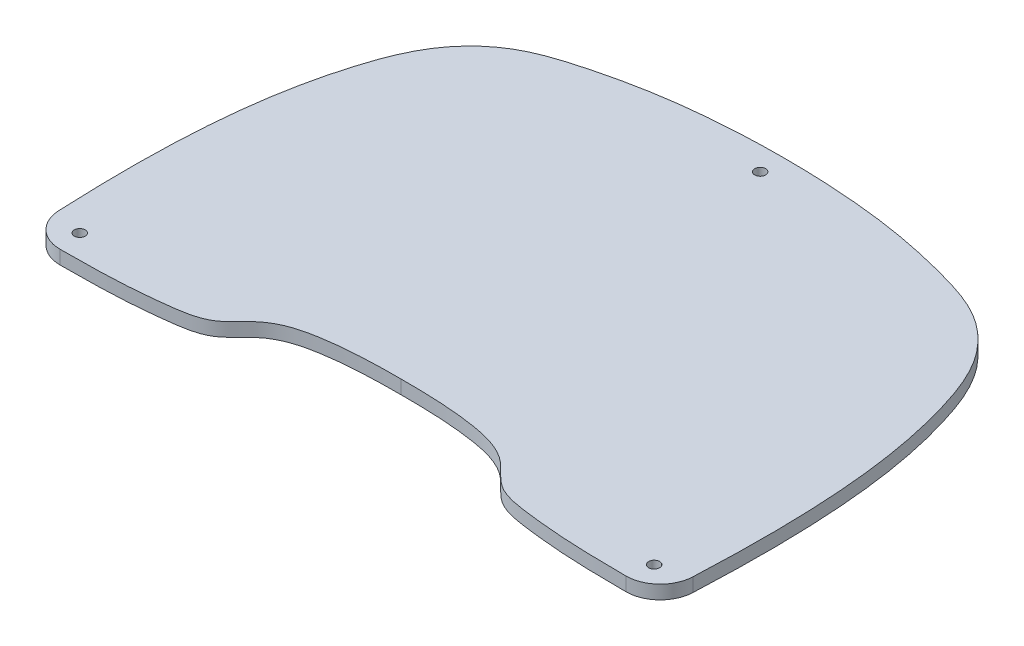
ISO-10303-21;
HEADER;
FILE_DESCRIPTION(('STEP AP214'),'2;1');
FILE_NAME('part.step','',(''),(''),'','','');
FILE_SCHEMA(('AUTOMOTIVE_DESIGN { 1 0 10303 214 1 1 1 1 }'));
ENDSEC;
DATA;
#1=APPLICATION_CONTEXT('core data for automotive mechanical design processes');
#2=APPLICATION_PROTOCOL_DEFINITION('international standard','automotive_design',2000,#1);
#3=PRODUCT_CONTEXT('',#1,'mechanical');
#4=PRODUCT('Part','Part','',(#3));
#5=PRODUCT_RELATED_PRODUCT_CATEGORY('part','',(#4));
#6=PRODUCT_DEFINITION_FORMATION('','',#4);
#7=PRODUCT_DEFINITION_CONTEXT('part definition',#1,'design');
#8=PRODUCT_DEFINITION('design','',#6,#7);
#9=PRODUCT_DEFINITION_SHAPE('','',#8);
#10=(LENGTH_UNIT() NAMED_UNIT(*) SI_UNIT(.MILLI.,.METRE.));
#11=(NAMED_UNIT(*) PLANE_ANGLE_UNIT() SI_UNIT($,.RADIAN.));
#12=(NAMED_UNIT(*) SI_UNIT($,.STERADIAN.) SOLID_ANGLE_UNIT());
#13=UNCERTAINTY_MEASURE_WITH_UNIT(LENGTH_MEASURE(1.E-05),#10,'distance_accuracy_value','');
#14=(GEOMETRIC_REPRESENTATION_CONTEXT(3) GLOBAL_UNCERTAINTY_ASSIGNED_CONTEXT((#13)) GLOBAL_UNIT_ASSIGNED_CONTEXT((#10,
#11,#12)) REPRESENTATION_CONTEXT('',''));
#15=CARTESIAN_POINT('',(0.,0.,0.));
#16=DIRECTION('',(0.,0.,1.));
#17=DIRECTION('',(1.,0.,0.));
#18=AXIS2_PLACEMENT_3D('',#15,#16,#17);
#19=CARTESIAN_POINT('',(0.,0.,0.));
#20=DIRECTION('',(0.,-1.,0.));
#21=DIRECTION('',(0.,0.,-1.));
#22=AXIS2_PLACEMENT_3D('',#19,#20,#21);
#23=PLANE('',#22);
#24=CARTESIAN_POINT('',(-84.,0.,-17.));
#25=DIRECTION('',(0.,1.,0.));
#26=DIRECTION('',(0.,0.,1.));
#27=AXIS2_PLACEMENT_3D('',#24,#25,#26);
#28=CIRCLE('',#27,1.6);
#29=CARTESIAN_POINT('',(-84.,0.,-15.4));
#30=VERTEX_POINT('',#29);
#31=EDGE_CURVE('E551',#30,#30,#28,.T.);
#32=ORIENTED_EDGE('',*,*,#31,.T.);
#33=EDGE_LOOP('',(#32));
#34=FACE_BOUND('',#33,.T.);
#35=CARTESIAN_POINT('',(84.,0.,-17.));
#36=DIRECTION('',(0.,1.,0.));
#37=DIRECTION('',(0.,0.,1.));
#38=AXIS2_PLACEMENT_3D('',#35,#36,#37);
#39=CIRCLE('',#38,1.6);
#40=CARTESIAN_POINT('',(84.,0.,-15.4));
#41=VERTEX_POINT('',#40);
#42=EDGE_CURVE('E562',#41,#41,#39,.T.);
#43=ORIENTED_EDGE('',*,*,#42,.T.);
#44=EDGE_LOOP('',(#43));
#45=FACE_BOUND('',#44,.T.);
#46=CARTESIAN_POINT('',(0.,0.,-132.));
#47=DIRECTION('',(0.,-1.,0.));
#48=DIRECTION('',(0.,0.,-1.));
#49=AXIS2_PLACEMENT_3D('',#46,#47,#48);
#50=CIRCLE('',#49,1.59999999999999);
#51=CARTESIAN_POINT('',(0.,0.,-133.6));
#52=VERTEX_POINT('',#51);
#53=EDGE_CURVE('E415',#52,#52,#50,.T.);
#54=ORIENTED_EDGE('',*,*,#53,.F.);
#55=EDGE_LOOP('',(#54));
#56=FACE_BOUND('',#55,.T.);
#57=CARTESIAN_POINT('',(92.2335145068298,0.,-9.99999999999992));
#58=CARTESIAN_POINT('',(93.1090313055752,0.,-24.461653992885));
#59=CARTESIAN_POINT('',(94.1412976787401,0.,-55.9294278930205));
#60=CARTESIAN_POINT('',(89.8487997363687,0.,-89.0425351081658));
#61=CARTESIAN_POINT('',(82.7766183598568,0.,-109.219212765688));
#62=CARTESIAN_POINT('',(77.5057588749509,0.,-118.879248593149));
#63=CARTESIAN_POINT('',(67.5606743100797,0.,-127.964233668267));
#64=CARTESIAN_POINT('',(51.2025143300991,0.,-133.204450958364));
#65=CARTESIAN_POINT('',(28.9563277305296,0.,-138.000468292935));
#66=CARTESIAN_POINT('',(10.5008714660227,0.,-139.));
#67=CARTESIAN_POINT('',(0.,0.,-139.));
#68=B_SPLINE_CURVE_WITH_KNOTS('',3,(#57,#58,#59,#60,#61,#62,#63,#64,#65,#66,#67),.UNSPECIFIED.,
.F.,.F.,(4,1,1,1,1,1,1,1,4),(0.048683264924351,0.273512027245697,0.499348707548917,
0.541604418075915,0.589205487808775,0.661188987966892,0.734095028903621,0.840040992214581,1.),.UNSPECIFIED.);
#69=CARTESIAN_POINT('',(0.,0.,-139.));
#70=VERTEX_POINT('',#69);
#71=CARTESIAN_POINT('',(92.7421838232833,0.,-19.5419697216967));
#72=VERTEX_POINT('',#71);
#73=EDGE_CURVE('E439',#70,#72,#68,.F.);
#74=ORIENTED_EDGE('',*,*,#73,.T.);
#75=CARTESIAN_POINT('',(82.7525074101446,0.,-19.9962440449628));
#76=DIRECTION('',(0.,-1.,0.));
#77=DIRECTION('',(0.,0.,-1.));
#78=AXIS2_PLACEMENT_3D('',#75,#76,#77);
#79=CIRCLE('',#78,10.);
#80=CARTESIAN_POINT('',(82.730131227239,0.,-9.9962690796722));
#81=VERTEX_POINT('',#80);
#82=EDGE_CURVE('E466',#72,#81,#79,.T.);
#83=ORIENTED_EDGE('',*,*,#82,.T.);
#84=CARTESIAN_POINT('',(92.2335145068298,0.,-9.99999999999993));
#85=CARTESIAN_POINT('',(80.6643013871117,0.,-9.99999999999993));
#86=CARTESIAN_POINT('',(67.3797546573043,0.,-9.83297634828211));
#87=CARTESIAN_POINT('',(50.8212813424914,0.,-11.7564459144532));
#88=CARTESIAN_POINT('',(41.6876400077974,0.,-13.09279348235));
#89=CARTESIAN_POINT('',(34.6105420896924,0.,-23.0328201001358));
#90=CARTESIAN_POINT('',(19.1579227536028,0.,-26.7732538807536));
#91=CARTESIAN_POINT('',(6.71734960168822,0.,-26.9999999999999));
#92=CARTESIAN_POINT('',(0.,0.,-26.9999999999999));
#93=B_SPLINE_CURVE_WITH_KNOTS('',3,(#84,#85,#86,#87,#88,#89,#90,#91,#92),.UNSPECIFIED.,.F.,.F.,
(4,1,1,1,1,1,4),(0.,0.354854857166383,0.417368962198801,0.52508950542856,0.626100692192997,
0.774450144496227,1.),.UNSPECIFIED.);
#94=CARTESIAN_POINT('',(0.,0.,-26.9999999999999));
#95=VERTEX_POINT('',#94);
#96=EDGE_CURVE('E419',#95,#81,#93,.F.);
#97=ORIENTED_EDGE('',*,*,#96,.F.);
#98=CARTESIAN_POINT('',(-92.2335145068298,0.,-9.99999999999993));
#99=CARTESIAN_POINT('',(-80.6643013871117,0.,-9.99999999999993));
#100=CARTESIAN_POINT('',(-67.3797546573043,0.,-9.83297634828211));
#101=CARTESIAN_POINT('',(-50.8212813424914,0.,-11.7564459144532));
#102=CARTESIAN_POINT('',(-41.6876400077974,0.,-13.09279348235));
#103=CARTESIAN_POINT('',(-34.6105420896924,0.,-23.0328201001358));
#104=CARTESIAN_POINT('',(-19.1579227536028,0.,-26.7732538807536));
#105=CARTESIAN_POINT('',(-6.71734960168822,0.,-26.9999999999999));
#106=CARTESIAN_POINT('',(0.,0.,-26.9999999999999));
#107=B_SPLINE_CURVE_WITH_KNOTS('',3,(#98,#99,#100,#101,#102,#103,#104,#105,#106),.UNSPECIFIED.,
.F.,.F.,(4,1,1,1,1,1,4),(0.,0.354854857166383,0.417368962198801,0.52508950542856,
0.626100692192997,0.774450144496227,1.),.UNSPECIFIED.);
#108=CARTESIAN_POINT('',(-82.730131227239,0.,-9.9962690796722));
#109=VERTEX_POINT('',#108);
#110=EDGE_CURVE('E407',#95,#109,#107,.F.);
#111=ORIENTED_EDGE('',*,*,#110,.T.);
#112=CARTESIAN_POINT('',(-82.7525074101446,0.,-19.9962440449628));
#113=DIRECTION('',(0.,-1.,0.));
#114=DIRECTION('',(0.,0.,-1.));
#115=AXIS2_PLACEMENT_3D('',#112,#113,#114);
#116=CIRCLE('',#115,10.);
#117=CARTESIAN_POINT('',(-92.7421838232834,0.,-19.5419697216967));
#118=VERTEX_POINT('',#117);
#119=EDGE_CURVE('E353',#109,#118,#116,.T.);
#120=ORIENTED_EDGE('',*,*,#119,.T.);
#121=CARTESIAN_POINT('',(-92.2335145068298,0.,-9.99999999999992));
#122=CARTESIAN_POINT('',(-93.1090313055752,0.,-24.461653992885));
#123=CARTESIAN_POINT('',(-94.1412976787401,0.,-55.9294278930205));
#124=CARTESIAN_POINT('',(-89.8487997363687,0.,-89.0425351081658));
#125=CARTESIAN_POINT('',(-82.7766183598568,0.,-109.219212765688));
#126=CARTESIAN_POINT('',(-77.5057588749509,0.,-118.879248593149));
#127=CARTESIAN_POINT('',(-67.5606743100797,0.,-127.964233668267));
#128=CARTESIAN_POINT('',(-51.2025143300991,0.,-133.204450958364));
#129=CARTESIAN_POINT('',(-28.9563277305296,0.,-138.000468292935));
#130=CARTESIAN_POINT('',(-10.5008714660227,0.,-139.));
#131=CARTESIAN_POINT('',(0.,0.,-139.));
#132=B_SPLINE_CURVE_WITH_KNOTS('',3,(#121,#122,#123,#124,#125,#126,#127,#128,#129,#130,#131),
.UNSPECIFIED.,.F.,.F.,(4,1,1,1,1,1,1,1,4),(0.048683264924351,0.273512027245697,
0.499348707548917,0.541604418075915,0.589205487808775,0.661188987966892,0.734095028903621,
0.840040992214581,1.),.UNSPECIFIED.);
#133=EDGE_CURVE('E431',#70,#118,#132,.F.);
#134=ORIENTED_EDGE('',*,*,#133,.F.);
#135=EDGE_LOOP('',(#74,#83,#97,#111,#120,#134));
#136=FACE_BOUND('',#135,.T.);
#137=ADVANCED_FACE('F332',(#34,#45,#56,#136),#23,.T.);
#138=CARTESIAN_POINT('',(92.2335145068298,-1.,-9.99999999999992));
#139=CARTESIAN_POINT('',(93.1090313055752,-1.,-24.461653992885));
#140=CARTESIAN_POINT('',(94.1412976787401,-1.,-55.9294278930205));
#141=CARTESIAN_POINT('',(89.8487997363687,-1.,-89.0425351081658));
#142=CARTESIAN_POINT('',(82.7766183598568,-1.,-109.219212765688));
#143=CARTESIAN_POINT('',(77.5057588749509,-1.,-118.879248593149));
#144=CARTESIAN_POINT('',(67.5606743100797,-1.,-127.964233668267));
#145=CARTESIAN_POINT('',(51.2025143300991,-1.,-133.204450958364));
#146=CARTESIAN_POINT('',(28.9563277305296,-1.,-138.000468292935));
#147=CARTESIAN_POINT('',(10.5008714660227,-1.,-139.));
#148=CARTESIAN_POINT('',(0.,-1.,-139.));
#149=B_SPLINE_CURVE_WITH_KNOTS('',3,(#138,#139,#140,#141,#142,#143,#144,#145,#146,#147,#148),
.UNSPECIFIED.,.F.,.F.,(4,1,1,1,1,1,1,1,4),(0.048683264924351,0.273512027245697,
0.499348707548917,0.541604418075915,0.589205487808775,0.661188987966892,0.734095028903621,
0.840040992214581,1.),.UNSPECIFIED.);
#150=DIRECTION('',(0.,1.,0.));
#151=VECTOR('',#150,1.);
#152=SURFACE_OF_LINEAR_EXTRUSION('',#149,#151);
#153=CARTESIAN_POINT('',(92.2335145068298,4.,-9.99999999999992));
#154=CARTESIAN_POINT('',(93.1090313055752,4.,-24.461653992885));
#155=CARTESIAN_POINT('',(94.1412976787401,4.,-55.9294278930205));
#156=CARTESIAN_POINT('',(89.8487997363687,4.,-89.0425351081658));
#157=CARTESIAN_POINT('',(82.7766183598568,4.,-109.219212765688));
#158=CARTESIAN_POINT('',(77.5057588749509,4.,-118.879248593149));
#159=CARTESIAN_POINT('',(67.5606743100797,4.,-127.964233668267));
#160=CARTESIAN_POINT('',(51.2025143300991,4.,-133.204450958364));
#161=CARTESIAN_POINT('',(28.9563277305296,4.,-138.000468292935));
#162=CARTESIAN_POINT('',(10.5008714660227,4.,-139.));
#163=CARTESIAN_POINT('',(0.,4.,-139.));
#164=B_SPLINE_CURVE_WITH_KNOTS('',3,(#153,#154,#155,#156,#157,#158,#159,#160,#161,#162,#163),
.UNSPECIFIED.,.F.,.F.,(4,1,1,1,1,1,1,1,4),(0.048683264924351,0.273512027245697,
0.499348707548917,0.541604418075915,0.589205487808775,0.661188987966892,0.734095028903621,
0.840040992214581,1.),.UNSPECIFIED.);
#165=CARTESIAN_POINT('',(92.7421838232833,4.,-19.5419697216967));
#166=VERTEX_POINT('',#165);
#167=CARTESIAN_POINT('',(0.,4.,-139.));
#168=VERTEX_POINT('',#167);
#169=EDGE_CURVE('E404',#166,#168,#164,.T.);
#170=ORIENTED_EDGE('',*,*,#169,.F.);
#171=DIRECTION('',(0.,1.,0.));
#172=VECTOR('',#171,1.);
#173=CARTESIAN_POINT('',(92.7421838232834,4.,-19.5419697216967));
#174=LINE('',#173,#172);
#175=EDGE_CURVE('E461',#166,#72,#174,.F.);
#176=ORIENTED_EDGE('',*,*,#175,.T.);
#177=ORIENTED_EDGE('',*,*,#73,.F.);
#178=DIRECTION('',(0.,1.,0.));
#179=VECTOR('',#178,1.);
#180=CARTESIAN_POINT('',(0.,-1.,-139.));
#181=LINE('',#180,#179);
#182=EDGE_CURVE('E410',#70,#168,#181,.T.);
#183=ORIENTED_EDGE('',*,*,#182,.T.);
#184=EDGE_LOOP('',(#170,#176,#177,#183));
#185=FACE_BOUND('',#184,.T.);
#186=ADVANCED_FACE('F482',(#185),#152,.T.);
#187=CARTESIAN_POINT('',(-92.2335145068298,-1.,-9.99999999999992));
#188=CARTESIAN_POINT('',(-93.1090313055752,-1.,-24.461653992885));
#189=CARTESIAN_POINT('',(-94.1412976787401,-1.,-55.9294278930205));
#190=CARTESIAN_POINT('',(-89.8487997363687,-1.,-89.0425351081658));
#191=CARTESIAN_POINT('',(-82.7766183598568,-1.,-109.219212765688));
#192=CARTESIAN_POINT('',(-77.5057588749509,-1.,-118.879248593149));
#193=CARTESIAN_POINT('',(-67.5606743100797,-1.,-127.964233668267));
#194=CARTESIAN_POINT('',(-51.2025143300991,-1.,-133.204450958364));
#195=CARTESIAN_POINT('',(-28.9563277305296,-1.,-138.000468292935));
#196=CARTESIAN_POINT('',(-10.5008714660227,-1.,-139.));
#197=CARTESIAN_POINT('',(0.,-1.,-139.));
#198=B_SPLINE_CURVE_WITH_KNOTS('',3,(#187,#188,#189,#190,#191,#192,#193,#194,#195,#196,#197),
.UNSPECIFIED.,.F.,.F.,(4,1,1,1,1,1,1,1,4),(0.048683264924351,0.273512027245697,
0.499348707548917,0.541604418075915,0.589205487808775,0.661188987966892,0.734095028903621,
0.840040992214581,1.),.UNSPECIFIED.);
#199=DIRECTION('',(0.,1.,0.));
#200=VECTOR('',#199,1.);
#201=SURFACE_OF_LINEAR_EXTRUSION('',#198,#200);
#202=ORIENTED_EDGE('',*,*,#133,.T.);
#203=DIRECTION('',(0.,1.,0.));
#204=VECTOR('',#203,1.);
#205=CARTESIAN_POINT('',(-92.7421838232834,0.,-19.5419697216967));
#206=LINE('',#205,#204);
#207=CARTESIAN_POINT('',(-92.7421838232834,4.,-19.5419697216967));
#208=VERTEX_POINT('',#207);
#209=EDGE_CURVE('E341',#118,#208,#206,.T.);
#210=ORIENTED_EDGE('',*,*,#209,.T.);
#211=CARTESIAN_POINT('',(-92.2335145068298,4.,-9.99999999999992));
#212=CARTESIAN_POINT('',(-93.1090313055752,4.,-24.461653992885));
#213=CARTESIAN_POINT('',(-94.1412976787401,4.,-55.9294278930205));
#214=CARTESIAN_POINT('',(-89.8487997363687,4.,-89.0425351081658));
#215=CARTESIAN_POINT('',(-82.7766183598568,4.,-109.219212765688));
#216=CARTESIAN_POINT('',(-77.5057588749509,4.,-118.879248593149));
#217=CARTESIAN_POINT('',(-67.5606743100797,4.,-127.964233668267));
#218=CARTESIAN_POINT('',(-51.2025143300991,4.,-133.204450958364));
#219=CARTESIAN_POINT('',(-28.9563277305296,4.,-138.000468292935));
#220=CARTESIAN_POINT('',(-10.5008714660227,4.,-139.));
#221=CARTESIAN_POINT('',(0.,4.,-139.));
#222=B_SPLINE_CURVE_WITH_KNOTS('',3,(#211,#212,#213,#214,#215,#216,#217,#218,#219,#220,#221),
.UNSPECIFIED.,.F.,.F.,(4,1,1,1,1,1,1,1,4),(0.048683264924351,0.273512027245697,
0.499348707548917,0.541604418075915,0.589205487808775,0.661188987966892,0.734095028903621,
0.840040992214581,1.),.UNSPECIFIED.);
#223=EDGE_CURVE('E394',#208,#168,#222,.T.);
#224=ORIENTED_EDGE('',*,*,#223,.T.);
#225=ORIENTED_EDGE('',*,*,#182,.F.);
#226=EDGE_LOOP('',(#202,#210,#224,#225));
#227=FACE_BOUND('',#226,.T.);
#228=ADVANCED_FACE('F472',(#227),#201,.F.);
#229=CARTESIAN_POINT('',(-92.2335145068298,-1.,-9.99999999999993));
#230=CARTESIAN_POINT('',(-80.6643013871117,-1.,-9.99999999999993));
#231=CARTESIAN_POINT('',(-67.3797546573043,-1.,-9.83297634828211));
#232=CARTESIAN_POINT('',(-50.8212813424914,-1.,-11.7564459144532));
#233=CARTESIAN_POINT('',(-41.6876400077974,-1.,-13.09279348235));
#234=CARTESIAN_POINT('',(-34.6105420896924,-1.,-23.0328201001358));
#235=CARTESIAN_POINT('',(-19.1579227536028,-1.,-26.7732538807536));
#236=CARTESIAN_POINT('',(-6.71734960168822,-1.,-26.9999999999999));
#237=CARTESIAN_POINT('',(0.,-1.,-26.9999999999999));
#238=B_SPLINE_CURVE_WITH_KNOTS('',3,(#229,#230,#231,#232,#233,#234,#235,#236,#237),
.UNSPECIFIED.,.F.,.F.,(4,1,1,1,1,1,4),(0.,0.354854857166383,0.417368962198801,0.52508950542856,
0.626100692192997,0.774450144496227,1.),.UNSPECIFIED.);
#239=DIRECTION('',(0.,1.,0.));
#240=VECTOR('',#239,1.);
#241=SURFACE_OF_LINEAR_EXTRUSION('',#238,#240);
#242=CARTESIAN_POINT('',(-92.2335145068298,4.,-9.99999999999993));
#243=CARTESIAN_POINT('',(-80.6643013871117,4.,-9.99999999999993));
#244=CARTESIAN_POINT('',(-67.3797546573043,4.,-9.83297634828211));
#245=CARTESIAN_POINT('',(-50.8212813424914,4.,-11.7564459144532));
#246=CARTESIAN_POINT('',(-41.6876400077974,4.,-13.09279348235));
#247=CARTESIAN_POINT('',(-34.6105420896924,4.,-23.0328201001358));
#248=CARTESIAN_POINT('',(-19.1579227536028,4.,-26.7732538807536));
#249=CARTESIAN_POINT('',(-6.71734960168822,4.,-26.9999999999999));
#250=CARTESIAN_POINT('',(0.,4.,-26.9999999999999));
#251=B_SPLINE_CURVE_WITH_KNOTS('',3,(#242,#243,#244,#245,#246,#247,#248,#249,#250),
.UNSPECIFIED.,.F.,.F.,(4,1,1,1,1,1,4),(0.,0.354854857166383,0.417368962198801,0.52508950542856,
0.626100692192997,0.774450144496227,1.),.UNSPECIFIED.);
#252=CARTESIAN_POINT('',(-82.730131227239,4.,-9.9962690796722));
#253=VERTEX_POINT('',#252);
#254=CARTESIAN_POINT('',(0.,4.,-26.9999999999999));
#255=VERTEX_POINT('',#254);
#256=EDGE_CURVE('E386',#253,#255,#251,.T.);
#257=ORIENTED_EDGE('',*,*,#256,.F.);
#258=DIRECTION('',(0.,1.,0.));
#259=VECTOR('',#258,1.);
#260=CARTESIAN_POINT('',(-82.730131227234,4.,-9.99626907967222));
#261=LINE('',#260,#259);
#262=EDGE_CURVE('E12',#253,#109,#261,.F.);
#263=ORIENTED_EDGE('',*,*,#262,.T.);
#264=ORIENTED_EDGE('',*,*,#110,.F.);
#265=DIRECTION('',(0.,1.,0.));
#266=VECTOR('',#265,1.);
#267=CARTESIAN_POINT('',(0.,-1.,-26.9999999999999));
#268=LINE('',#267,#266);
#269=EDGE_CURVE('E400',#95,#255,#268,.T.);
#270=ORIENTED_EDGE('',*,*,#269,.T.);
#271=EDGE_LOOP('',(#257,#263,#264,#270));
#272=FACE_BOUND('',#271,.T.);
#273=ADVANCED_FACE('F406',(#272),#241,.T.);
#274=CARTESIAN_POINT('',(92.2335145068298,-1.,-9.99999999999993));
#275=CARTESIAN_POINT('',(80.6643013871117,-1.,-9.99999999999993));
#276=CARTESIAN_POINT('',(67.3797546573043,-1.,-9.83297634828211));
#277=CARTESIAN_POINT('',(50.8212813424914,-1.,-11.7564459144532));
#278=CARTESIAN_POINT('',(41.6876400077974,-1.,-13.09279348235));
#279=CARTESIAN_POINT('',(34.6105420896924,-1.,-23.0328201001358));
#280=CARTESIAN_POINT('',(19.1579227536028,-1.,-26.7732538807536));
#281=CARTESIAN_POINT('',(6.71734960168822,-1.,-26.9999999999999));
#282=CARTESIAN_POINT('',(0.,-1.,-26.9999999999999));
#283=B_SPLINE_CURVE_WITH_KNOTS('',3,(#274,#275,#276,#277,#278,#279,#280,#281,#282),
.UNSPECIFIED.,.F.,.F.,(4,1,1,1,1,1,4),(0.,0.354854857166383,0.417368962198801,0.52508950542856,
0.626100692192997,0.774450144496227,1.),.UNSPECIFIED.);
#284=DIRECTION('',(0.,1.,0.));
#285=VECTOR('',#284,1.);
#286=SURFACE_OF_LINEAR_EXTRUSION('',#283,#285);
#287=ORIENTED_EDGE('',*,*,#96,.T.);
#288=DIRECTION('',(0.,1.,0.));
#289=VECTOR('',#288,1.);
#290=CARTESIAN_POINT('',(82.730131227234,0.,-9.99626907967222));
#291=LINE('',#290,#289);
#292=CARTESIAN_POINT('',(82.730131227239,4.,-9.9962690796722));
#293=VERTEX_POINT('',#292);
#294=EDGE_CURVE('E402',#81,#293,#291,.T.);
#295=ORIENTED_EDGE('',*,*,#294,.T.);
#296=CARTESIAN_POINT('',(92.2335145068298,4.,-9.99999999999993));
#297=CARTESIAN_POINT('',(80.6643013871117,4.,-9.99999999999993));
#298=CARTESIAN_POINT('',(67.3797546573043,4.,-9.83297634828211));
#299=CARTESIAN_POINT('',(50.8212813424914,4.,-11.7564459144532));
#300=CARTESIAN_POINT('',(41.6876400077974,4.,-13.09279348235));
#301=CARTESIAN_POINT('',(34.6105420896924,4.,-23.0328201001358));
#302=CARTESIAN_POINT('',(19.1579227536028,4.,-26.7732538807536));
#303=CARTESIAN_POINT('',(6.71734960168822,4.,-26.9999999999999));
#304=CARTESIAN_POINT('',(0.,4.,-26.9999999999999));
#305=B_SPLINE_CURVE_WITH_KNOTS('',3,(#296,#297,#298,#299,#300,#301,#302,#303,#304),
.UNSPECIFIED.,.F.,.F.,(4,1,1,1,1,1,4),(0.,0.354854857166383,0.417368962198801,0.52508950542856,
0.626100692192997,0.774450144496227,1.),.UNSPECIFIED.);
#306=EDGE_CURVE('E389',#293,#255,#305,.T.);
#307=ORIENTED_EDGE('',*,*,#306,.T.);
#308=ORIENTED_EDGE('',*,*,#269,.F.);
#309=EDGE_LOOP('',(#287,#295,#307,#308));
#310=FACE_BOUND('',#309,.T.);
#311=ADVANCED_FACE('F399',(#310),#286,.F.);
#312=CARTESIAN_POINT('',(0.,-1.,-132.));
#313=DIRECTION('',(0.,1.,0.));
#314=DIRECTION('',(0.,0.,1.));
#315=AXIS2_PLACEMENT_3D('',#312,#313,#314);
#316=CYLINDRICAL_SURFACE('',#315,1.59999999999999);
#317=ORIENTED_EDGE('',*,*,#53,.T.);
#318=EDGE_LOOP('',(#317));
#319=FACE_BOUND('',#318,.T.);
#320=CARTESIAN_POINT('',(0.,4.,-132.));
#321=DIRECTION('',(0.,1.,0.));
#322=DIRECTION('',(0.,0.,1.));
#323=AXIS2_PLACEMENT_3D('',#320,#321,#322);
#324=CIRCLE('',#323,1.59999999999999);
#325=CARTESIAN_POINT('',(0.,4.,-130.4));
#326=VERTEX_POINT('',#325);
#327=EDGE_CURVE('E480',#326,#326,#324,.T.);
#328=ORIENTED_EDGE('',*,*,#327,.T.);
#329=EDGE_LOOP('',(#328));
#330=FACE_BOUND('',#329,.T.);
#331=ADVANCED_FACE('F493',(#319,#330),#316,.F.);
#332=CARTESIAN_POINT('',(0.,4.,0.));
#333=DIRECTION('',(0.,-1.,0.));
#334=DIRECTION('',(0.,0.,-1.));
#335=AXIS2_PLACEMENT_3D('',#332,#333,#334);
#336=PLANE('',#335);
#337=CARTESIAN_POINT('',(-84.,4.,-17.));
#338=DIRECTION('',(0.,1.,0.));
#339=DIRECTION('',(0.,0.,1.));
#340=AXIS2_PLACEMENT_3D('',#337,#338,#339);
#341=CIRCLE('',#340,1.6);
#342=CARTESIAN_POINT('',(-84.,4.,-15.4));
#343=VERTEX_POINT('',#342);
#344=EDGE_CURVE('E554',#343,#343,#341,.T.);
#345=ORIENTED_EDGE('',*,*,#344,.F.);
#346=EDGE_LOOP('',(#345));
#347=FACE_BOUND('',#346,.T.);
#348=CARTESIAN_POINT('',(84.,4.,-17.));
#349=DIRECTION('',(0.,1.,0.));
#350=DIRECTION('',(0.,0.,1.));
#351=AXIS2_PLACEMENT_3D('',#348,#349,#350);
#352=CIRCLE('',#351,1.6);
#353=CARTESIAN_POINT('',(84.,4.,-15.4));
#354=VERTEX_POINT('',#353);
#355=EDGE_CURVE('E556',#354,#354,#352,.T.);
#356=ORIENTED_EDGE('',*,*,#355,.F.);
#357=EDGE_LOOP('',(#356));
#358=FACE_BOUND('',#357,.T.);
#359=ORIENTED_EDGE('',*,*,#327,.F.);
#360=EDGE_LOOP('',(#359));
#361=FACE_BOUND('',#360,.T.);
#362=ORIENTED_EDGE('',*,*,#306,.F.);
#363=CARTESIAN_POINT('',(82.7525074101446,4.,-19.9962440449628));
#364=DIRECTION('',(0.,-1.,0.));
#365=DIRECTION('',(0.,0.,-1.));
#366=AXIS2_PLACEMENT_3D('',#363,#364,#365);
#367=CIRCLE('',#366,10.);
#368=EDGE_CURVE('E458',#293,#166,#367,.F.);
#369=ORIENTED_EDGE('',*,*,#368,.T.);
#370=ORIENTED_EDGE('',*,*,#169,.T.);
#371=ORIENTED_EDGE('',*,*,#223,.F.);
#372=CARTESIAN_POINT('',(-82.7525074101446,4.,-19.9962440449628));
#373=DIRECTION('',(0.,-1.,0.));
#374=DIRECTION('',(0.,0.,-1.));
#375=AXIS2_PLACEMENT_3D('',#372,#373,#374);
#376=CIRCLE('',#375,10.);
#377=EDGE_CURVE('E391',#208,#253,#376,.F.);
#378=ORIENTED_EDGE('',*,*,#377,.T.);
#379=ORIENTED_EDGE('',*,*,#256,.T.);
#380=EDGE_LOOP('',(#362,#369,#370,#371,#378,#379));
#381=FACE_BOUND('',#380,.T.);
#382=ADVANCED_FACE('F388',(#347,#358,#361,#381),#336,.F.);
#383=CARTESIAN_POINT('',(82.7525074101446,2.,-19.9962440449628));
#384=DIRECTION('',(0.,1.,0.));
#385=DIRECTION('',(0.,0.,1.));
#386=AXIS2_PLACEMENT_3D('',#383,#384,#385);
#387=CYLINDRICAL_SURFACE('',#386,10.);
#388=ORIENTED_EDGE('',*,*,#82,.F.);
#389=ORIENTED_EDGE('',*,*,#175,.F.);
#390=ORIENTED_EDGE('',*,*,#368,.F.);
#391=ORIENTED_EDGE('',*,*,#294,.F.);
#392=EDGE_LOOP('',(#388,#389,#390,#391));
#393=FACE_BOUND('',#392,.T.);
#394=ADVANCED_FACE('F485',(#393),#387,.T.);
#395=CARTESIAN_POINT('',(-82.7525074101446,2.,-19.9962440449628));
#396=DIRECTION('',(0.,1.,0.));
#397=DIRECTION('',(0.,0.,1.));
#398=AXIS2_PLACEMENT_3D('',#395,#396,#397);
#399=CYLINDRICAL_SURFACE('',#398,10.);
#400=ORIENTED_EDGE('',*,*,#119,.F.);
#401=ORIENTED_EDGE('',*,*,#262,.F.);
#402=ORIENTED_EDGE('',*,*,#377,.F.);
#403=ORIENTED_EDGE('',*,*,#209,.F.);
#404=EDGE_LOOP('',(#400,#401,#402,#403));
#405=FACE_BOUND('',#404,.T.);
#406=ADVANCED_FACE('F334',(#405),#399,.T.);
#407=CARTESIAN_POINT('',(84.,0.,-17.));
#408=DIRECTION('',(0.,1.,0.));
#409=DIRECTION('',(0.,0.,1.));
#410=AXIS2_PLACEMENT_3D('',#407,#408,#409);
#411=CYLINDRICAL_SURFACE('',#410,1.6);
#412=ORIENTED_EDGE('',*,*,#42,.F.);
#413=EDGE_LOOP('',(#412));
#414=FACE_BOUND('',#413,.T.);
#415=ORIENTED_EDGE('',*,*,#355,.T.);
#416=EDGE_LOOP('',(#415));
#417=FACE_BOUND('',#416,.T.);
#418=ADVANCED_FACE('F491',(#414,#417),#411,.F.);
#419=CARTESIAN_POINT('',(-84.,0.,-17.));
#420=DIRECTION('',(0.,1.,0.));
#421=DIRECTION('',(0.,0.,1.));
#422=AXIS2_PLACEMENT_3D('',#419,#420,#421);
#423=CYLINDRICAL_SURFACE('',#422,1.6);
#424=ORIENTED_EDGE('',*,*,#31,.F.);
#425=EDGE_LOOP('',(#424));
#426=FACE_BOUND('',#425,.T.);
#427=ORIENTED_EDGE('',*,*,#344,.T.);
#428=EDGE_LOOP('',(#427));
#429=FACE_BOUND('',#428,.T.);
#430=ADVANCED_FACE('F543',(#426,#429),#423,.F.);
#431=CLOSED_SHELL('',(#137,#186,#228,#273,#311,#331,#382,#394,#406,#418,#430));
#432=MANIFOLD_SOLID_BREP('B2',#431);
#433=ADVANCED_BREP_SHAPE_REPRESENTATION('',(#18,#432),#14);
#434=SHAPE_DEFINITION_REPRESENTATION(#9,#433);
ENDSEC;
END-ISO-10303-21;
